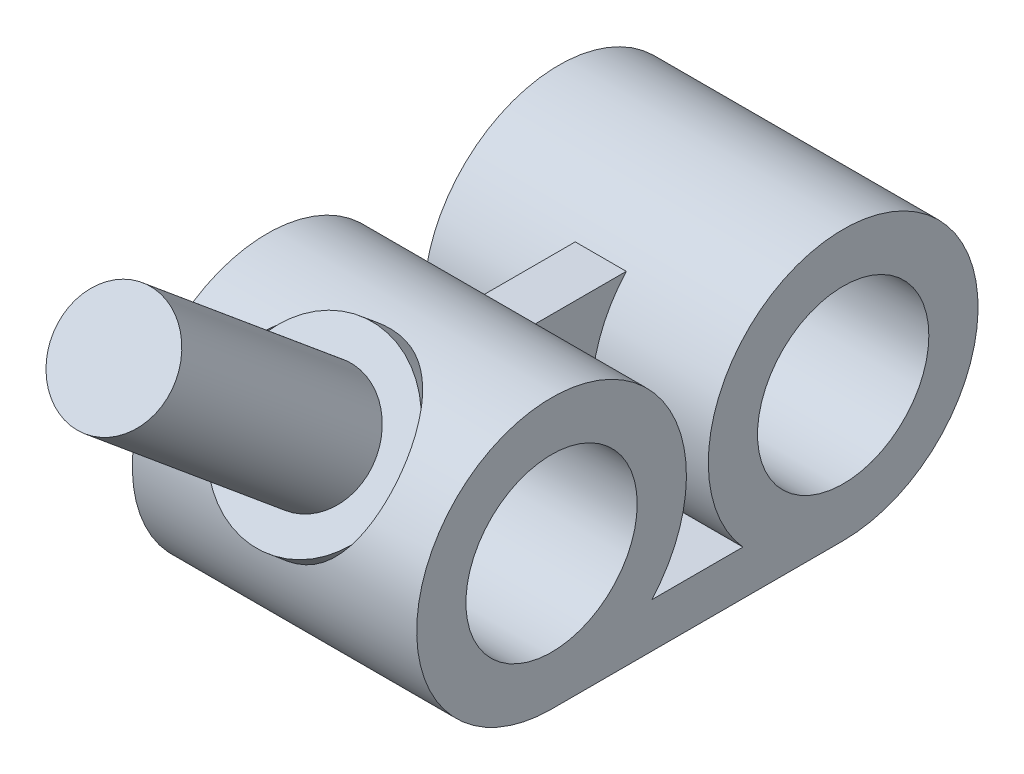
ISO-10303-21;
HEADER;
FILE_DESCRIPTION(('STEP AP214'),'2;1');
FILE_NAME('part.step','',(''),(''),'','','');
FILE_SCHEMA(('AUTOMOTIVE_DESIGN { 1 0 10303 214 1 1 1 1 }'));
ENDSEC;
DATA;
#1=APPLICATION_CONTEXT('core data for automotive mechanical design processes');
#2=APPLICATION_PROTOCOL_DEFINITION('international standard','automotive_design',2000,#1);
#3=PRODUCT_CONTEXT('',#1,'mechanical');
#4=PRODUCT('Part','Part','',(#3));
#5=PRODUCT_RELATED_PRODUCT_CATEGORY('part','',(#4));
#6=PRODUCT_DEFINITION_FORMATION('','',#4);
#7=PRODUCT_DEFINITION_CONTEXT('part definition',#1,'design');
#8=PRODUCT_DEFINITION('design','',#6,#7);
#9=PRODUCT_DEFINITION_SHAPE('','',#8);
#10=(LENGTH_UNIT() NAMED_UNIT(*) SI_UNIT(.MILLI.,.METRE.));
#11=(NAMED_UNIT(*) PLANE_ANGLE_UNIT() SI_UNIT($,.RADIAN.));
#12=(NAMED_UNIT(*) SI_UNIT($,.STERADIAN.) SOLID_ANGLE_UNIT());
#13=UNCERTAINTY_MEASURE_WITH_UNIT(LENGTH_MEASURE(1.E-05),#10,'distance_accuracy_value','');
#14=(GEOMETRIC_REPRESENTATION_CONTEXT(3) GLOBAL_UNCERTAINTY_ASSIGNED_CONTEXT((#13)) GLOBAL_UNIT_ASSIGNED_CONTEXT((#10,
#11,#12)) REPRESENTATION_CONTEXT('',''));
#15=CARTESIAN_POINT('',(0.,0.,0.));
#16=DIRECTION('',(0.,0.,1.));
#17=DIRECTION('',(1.,0.,0.));
#18=AXIS2_PLACEMENT_3D('',#15,#16,#17);
#19=CARTESIAN_POINT('',(3.9,6.7367906511766,8.10600096978896));
#20=DIRECTION('',(0.,-0.639164198403852,-0.769070300738991));
#21=DIRECTION('',(0.,0.769070300738991,-0.639164198403852));
#22=AXIS2_PLACEMENT_3D('',#19,#20,#21);
#23=CYLINDRICAL_SURFACE('',#22,2.475);
#24=CARTESIAN_POINT('',(3.9,3.66136733659236,0.533272795191256));
#25=CARTESIAN_POINT('',(3.96035169923798,3.66136684020359,0.533269791389044));
#26=CARTESIAN_POINT('',(4.02068909466153,3.66094173701192,0.536221693558098));
#27=CARTESIAN_POINT('',(4.14079766349037,3.65921193679614,0.547896744479978));
#28=CARTESIAN_POINT('',(4.20056865792641,3.65790697057511,0.556621659489321));
#29=CARTESIAN_POINT('',(4.37839333371762,3.65255795032774,0.591084684326416));
#30=CARTESIAN_POINT('',(4.49486852873705,3.64707958768171,0.625110413267217));
#31=CARTESIAN_POINT('',(4.71920355722017,3.63132863811482,0.710830204544946));
#32=CARTESIAN_POINT('',(4.82713633021219,3.62110332507454,0.762348730874311));
#33=CARTESIAN_POINT('',(5.03446891778196,3.59456556988517,0.879018074606407));
#34=CARTESIAN_POINT('',(5.13386719589653,3.57825203448935,0.944171339441164));
#35=CARTESIAN_POINT('',(5.338373200878,3.53503057336775,1.09575503706831));
#36=CARTESIAN_POINT('',(5.44192921817235,3.50686186472844,1.18391995855905));
#37=CARTESIAN_POINT('',(5.63582243337974,3.43854773563366,1.36975350354827));
#38=CARTESIAN_POINT('',(5.7261465231037,3.39839055683355,1.46743139374181));
#39=CARTESIAN_POINT('',(5.90417477709713,3.2972910923514,1.68344984058107));
#40=CARTESIAN_POINT('',(5.98957583055752,3.23417165637583,1.80272632927426));
#41=CARTESIAN_POINT('',(6.1004208715943,3.12457184002453,1.98293251063721));
#42=CARTESIAN_POINT('',(6.1344997717829,3.08553964918471,2.0432323927745));
#43=CARTESIAN_POINT('',(6.19643804062169,3.00241800663968,2.16351625627321));
#44=CARTESIAN_POINT('',(6.22430206096339,2.95833237498794,2.22350044086853));
#45=CARTESIAN_POINT('',(6.2705754025269,2.87040449540901,2.33565077062593));
#46=CARTESIAN_POINT('',(6.28969482229228,2.82709009859255,2.38793886803995));
#47=CARTESIAN_POINT('',(6.3223353750452,2.73673535609184,2.49097585801401));
#48=CARTESIAN_POINT('',(6.33585995916327,2.68969732869965,2.54172568148645));
#49=CARTESIAN_POINT('',(6.35706731715457,2.5922174279121,2.64106691695343));
#50=CARTESIAN_POINT('',(6.36475467336565,2.54177825842029,2.68965999376011));
#51=CARTESIAN_POINT('',(6.37416011715353,2.437930260991,2.78413810708275));
#52=CARTESIAN_POINT('',(6.37587905624015,2.38452185777674,2.8300235289796));
#53=CARTESIAN_POINT('',(6.3723946784436,2.23737554966483,2.94927977221814));
#54=CARTESIAN_POINT('',(6.36157986361421,2.14129834419299,3.01970474210796));
#55=CARTESIAN_POINT('',(6.32328866483668,1.94524492919007,3.14958425028785));
#56=CARTESIAN_POINT('',(6.29581106470832,1.84526843555692,3.20903798739849));
#57=CARTESIAN_POINT('',(6.22574011699369,1.64497923872544,3.31615426825691));
#58=CARTESIAN_POINT('',(6.18321287067475,1.54466987633284,3.36386685225359));
#59=CARTESIAN_POINT('',(6.08469000007099,1.34607709611851,3.44814786732903));
#60=CARTESIAN_POINT('',(6.02869194628293,1.24779404722435,3.484714285461));
#61=CARTESIAN_POINT('',(5.89663048726598,1.04292897624604,3.55181371992157));
#62=CARTESIAN_POINT('',(5.81889558606121,0.936959248478283,3.58091739766624));
#63=CARTESIAN_POINT('',(5.64990335458852,0.733515810748773,3.6280683668741));
#64=CARTESIAN_POINT('',(5.55862513343509,0.63605560254073,3.64609835207861));
#65=CARTESIAN_POINT('',(5.34855399116995,0.438416743885214,3.67549126174908));
#66=CARTESIAN_POINT('',(5.22769071697444,0.340201989737079,3.68536817185947));
#67=CARTESIAN_POINT('',(4.97094269146941,0.165275539321959,3.69734508513184));
#68=CARTESIAN_POINT('',(4.83508348084817,0.0885280452381102,3.69945810729078));
#69=CARTESIAN_POINT('',(4.59128093447964,-0.0180279134784635,3.70022379964095));
#70=CARTESIAN_POINT('',(4.48647582390875,-0.0549838747794087,3.69969371964533));
#71=CARTESIAN_POINT('',(4.27224426573367,-0.110990737454933,3.69844219099289));
#72=CARTESIAN_POINT('',(4.16282613685571,-0.130072540151083,3.69772107538347));
#73=CARTESIAN_POINT('',(3.94179610067674,-0.148386165937669,3.69703540939428));
#74=CARTESIAN_POINT('',(3.83017652553227,-0.147528086146994,3.69707428546149));
#75=CARTESIAN_POINT('',(3.60887646156706,-0.125837741322033,3.69787221162281));
#76=CARTESIAN_POINT('',(3.49919736044741,-0.104991727055434,3.69863175744502));
#77=CARTESIAN_POINT('',(3.29035376483972,-0.0470865010145389,3.69980319848386));
#78=CARTESIAN_POINT('',(3.19093831687886,-0.0109088206921487,3.70023085475316));
#79=CARTESIAN_POINT('',(2.9980613093856,0.0747869941949811,3.6994909080613));
#80=CARTESIAN_POINT('',(2.90460441065686,0.124315417234841,3.69832207195895));
#81=CARTESIAN_POINT('',(2.68242736270079,0.259827162489084,3.69174105198635));
#82=CARTESIAN_POINT('',(2.55754555011694,0.352047506849025,3.68460673214295));
#83=CARTESIAN_POINT('',(2.32346335686569,0.553603858278269,3.65976242348984));
#84=CARTESIAN_POINT('',(2.214291340759,0.662970097263978,3.64203359599904));
#85=CARTESIAN_POINT('',(2.01265755981257,0.894839473689987,3.59213483481954));
#86=CARTESIAN_POINT('',(1.92033120026324,1.01743744500216,3.55985455275018));
#87=CARTESIAN_POINT('',(1.75636732590912,1.27020199372295,3.47766409280892));
#88=CARTESIAN_POINT('',(1.6846882830782,1.40035273732642,3.42778975808418));
#89=CARTESIAN_POINT('',(1.57847891610148,1.63421382525544,3.32145739776305));
#90=CARTESIAN_POINT('',(1.53926011037175,1.73752052726545,3.26878833572464));
#91=CARTESIAN_POINT('',(1.47737828657382,1.94226334362736,3.15142609248525));
#92=CARTESIAN_POINT('',(1.4547042180974,2.04370066234117,3.08674097323169));
#93=CARTESIAN_POINT('',(1.42711025529208,2.24161426964071,2.94617197449559));
#94=CARTESIAN_POINT('',(1.42224655995015,2.33807390933849,2.87025343160072));
#95=CARTESIAN_POINT('',(1.43073097465891,2.52248884019421,2.70961147252231));
#96=CARTESIAN_POINT('',(1.44408044704879,2.61044349465495,2.62488739812572));
#97=CARTESIAN_POINT('',(1.48708693625634,2.77141307523469,2.45405103380299));
#98=CARTESIAN_POINT('',(1.51590295012298,2.84495238492219,2.36821564931763));
#99=CARTESIAN_POINT('',(1.58790375351059,2.98127921911922,2.19412891144384));
#100=CARTESIAN_POINT('',(1.63109108906794,3.04406483550719,2.10587713250901));
#101=CARTESIAN_POINT('',(1.73436120616424,3.16350747401506,1.92228428855463));
#102=CARTESIAN_POINT('',(1.79554428197063,3.21923093836584,1.82695929950726));
#103=CARTESIAN_POINT('',(1.93108487113476,3.31866069029091,1.63944166914076));
#104=CARTESIAN_POINT('',(2.00545298265339,3.36235723794035,1.54725161927362));
#105=CARTESIAN_POINT('',(2.17908265059583,3.44516416229748,1.35410402046793));
#106=CARTESIAN_POINT('',(2.28042654226146,3.48234657509862,1.2541887916594));
#107=CARTESIAN_POINT('',(2.49754989313856,3.54424164851188,1.06680679731168));
#108=CARTESIAN_POINT('',(2.61333484269171,3.56894954831031,0.979344793590898));
#109=CARTESIAN_POINT('',(2.83981814085063,3.6053708654268,0.834279564335827));
#110=CARTESIAN_POINT('',(2.94867850108483,3.61847673892284,0.774165929914656));
#111=CARTESIAN_POINT('',(3.17479572840557,3.63893420001597,0.67149963005829));
#112=CARTESIAN_POINT('',(3.2920298538377,3.64630077105362,0.62890137609596));
#113=CARTESIAN_POINT('',(3.49170169712941,3.65488408641233,0.57641481381412));
#114=CARTESIAN_POINT('',(3.57248064832151,3.65733858348706,0.560334810994783));
#115=CARTESIAN_POINT('',(3.73551536659048,3.66058044940817,0.538766466397052));
#116=CARTESIAN_POINT('',(3.81777096009196,3.66136801292081,0.533276887864288));
#117=CARTESIAN_POINT('',(3.9,3.66136733659236,0.533272795191256));
#118=B_SPLINE_CURVE_WITH_KNOTS('',3,(#24,#25,#26,#27,#28,#29,#30,#31,#32,#33,#34,#35,#36,#37,
#38,#39,#40,#41,#42,#43,#44,#45,#46,#47,#48,#49,#50,#51,#52,#53,#54,#55,#56,#57,#58,#59,#60,#61,
#62,#63,#64,#65,#66,#67,#68,#69,#70,#71,#72,#73,#74,#75,#76,#77,#78,#79,#80,#81,#82,#83,#84,#85,
#86,#87,#88,#89,#90,#91,#92,#93,#94,#95,#96,#97,#98,#99,#100,#101,#102,#103,#104,#105,#106,#107,
#108,#109,#110,#111,#112,#113,#114,#115,#116,#117),.UNSPECIFIED.,.T.,.F.,(4,2,2,2,2,2,2,2,2,2,2,
2,2,2,2,2,2,2,2,2,2,2,2,2,2,2,2,2,2,2,2,2,2,2,2,2,2,2,2,2,2,2,2,2,2,2,4),(0.,0.180952197601988,
0.361959783245286,0.724241031221584,1.08298934167057,1.44180210266734,1.85692066826374,
2.27244772914867,2.74857368162986,2.98676107618658,3.22476959031655,3.43606931192867,
3.64723849991097,3.85824174408705,4.0692148833432,4.42613967026706,4.78309051148555,
5.13849261924464,5.49395887303053,5.89625135628618,6.29917096359412,6.76518101533257,
7.23040927327125,7.56249423563766,7.89400401528303,8.22700876077034,8.56024273688472,
8.87647382373506,9.19294930773093,9.6567574676101,10.1213928147843,10.5896125117048,
11.0568837938154,11.4225625231499,11.7879967875957,12.1545831573178,12.521196949088,
12.8696411084721,13.218147031433,13.5954176720759,13.9729929500295,14.4125019393002,
14.8521785376569,15.2259657098504,15.5987737453451,15.845349460886,16.0918963794639),.UNSPECIFIED.);
#119=CARTESIAN_POINT('',(1.91814875622728,3.30693524450748,1.65956920198911));
#120=VERTEX_POINT('',#119);
#121=CARTESIAN_POINT('',(5.88185124377272,3.30693524450748,1.65956920198911));
#122=VERTEX_POINT('',#121);
#123=EDGE_CURVE('E130',#120,#122,#118,.T.);
#124=ORIENTED_EDGE('',*,*,#123,.F.);
#125=CARTESIAN_POINT('',(3.9,2.16676663258906,2.60714831950518));
#126=DIRECTION('',(0.,0.639164198403852,0.769070300738991));
#127=DIRECTION('',(0.,-0.769070300738991,0.639164198403852));
#128=AXIS2_PLACEMENT_3D('',#125,#126,#127);
#129=CIRCLE('',#128,2.475);
#130=EDGE_CURVE('E125',#122,#120,#129,.T.);
#131=ORIENTED_EDGE('',*,*,#130,.F.);
#132=EDGE_LOOP('',(#124,#131));
#133=FACE_BOUND('',#132,.T.);
#134=ADVANCED_FACE('F32',(#133),#23,.T.);
#135=CARTESIAN_POINT('',(5.88185124377272,1.02659802067064,3.55472743702125));
#136=VERTEX_POINT('',#135);
#137=CARTESIAN_POINT('',(1.91814875622728,1.02659802067064,3.55472743702125));
#138=VERTEX_POINT('',#137);
#139=EDGE_CURVE('E126',#136,#138,#118,.T.);
#140=ORIENTED_EDGE('',*,*,#139,.F.);
#141=EDGE_CURVE('E110',#138,#136,#129,.T.);
#142=ORIENTED_EDGE('',*,*,#141,.F.);
#143=EDGE_LOOP('',(#140,#142));
#144=FACE_BOUND('',#143,.T.);
#145=ADVANCED_FACE('F127',(#144),#23,.T.);
#146=CARTESIAN_POINT('',(4.6,0.,0.));
#147=DIRECTION('',(1.,0.,0.));
#148=DIRECTION('',(0.,0.,-1.));
#149=AXIS2_PLACEMENT_3D('',#146,#147,#148);
#150=PLANE('',#149);
#151=CARTESIAN_POINT('',(4.6,0.,-8.));
#152=DIRECTION('',(1.,0.,0.));
#153=DIRECTION('',(0.,0.,-1.));
#154=AXIS2_PLACEMENT_3D('',#151,#152,#153);
#155=CIRCLE('',#154,3.69999873615607);
#156=CARTESIAN_POINT('',(4.6,2.47537686980316,-5.25));
#157=VERTEX_POINT('',#156);
#158=CARTESIAN_POINT('',(4.6,-2.47537686980316,-5.25));
#159=VERTEX_POINT('',#158);
#160=EDGE_CURVE('E245',#157,#159,#155,.T.);
#161=ORIENTED_EDGE('',*,*,#160,.F.);
#162=DIRECTION('',(0.,0.,-1.));
#163=VECTOR('',#162,1.);
#164=CARTESIAN_POINT('',(4.6,2.47537686980316,0.));
#165=LINE('',#164,#163);
#166=CARTESIAN_POINT('',(4.6,2.47537686980316,-2.75));
#167=VERTEX_POINT('',#166);
#168=EDGE_CURVE('E275',#167,#157,#165,.T.);
#169=ORIENTED_EDGE('',*,*,#168,.F.);
#170=CARTESIAN_POINT('',(4.6,0.,0.));
#171=DIRECTION('',(1.,0.,0.));
#172=DIRECTION('',(0.,0.,-1.));
#173=AXIS2_PLACEMENT_3D('',#170,#171,#172);
#174=CIRCLE('',#173,3.69999873615607);
#175=CARTESIAN_POINT('',(4.6,-2.47537686980316,-2.75));
#176=VERTEX_POINT('',#175);
#177=EDGE_CURVE('E252',#176,#167,#174,.T.);
#178=ORIENTED_EDGE('',*,*,#177,.F.);
#179=DIRECTION('',(0.,0.,-1.));
#180=VECTOR('',#179,1.);
#181=CARTESIAN_POINT('',(4.6,-2.47537686980316,0.));
#182=LINE('',#181,#180);
#183=EDGE_CURVE('E240',#176,#159,#182,.T.);
#184=ORIENTED_EDGE('',*,*,#183,.T.);
#185=EDGE_LOOP('',(#161,#169,#178,#184));
#186=FACE_BOUND('',#185,.T.);
#187=ADVANCED_FACE('F178',(#186),#150,.T.);
#188=CARTESIAN_POINT('',(7.8,0.,0.));
#189=DIRECTION('',(1.,0.,0.));
#190=DIRECTION('',(0.,0.,-1.));
#191=AXIS2_PLACEMENT_3D('',#188,#189,#190);
#192=PLANE('',#191);
#193=CARTESIAN_POINT('',(7.8,0.,0.));
#194=DIRECTION('',(1.,0.,0.));
#195=DIRECTION('',(0.,0.,-1.));
#196=AXIS2_PLACEMENT_3D('',#193,#194,#195);
#197=CIRCLE('',#196,2.35);
#198=CARTESIAN_POINT('',(7.8,0.,-2.35));
#199=VERTEX_POINT('',#198);
#200=EDGE_CURVE('E221',#199,#199,#197,.T.);
#201=ORIENTED_EDGE('',*,*,#200,.F.);
#202=EDGE_LOOP('',(#201));
#203=FACE_BOUND('',#202,.T.);
#204=CARTESIAN_POINT('',(7.8,0.,-8.));
#205=DIRECTION('',(1.,0.,0.));
#206=DIRECTION('',(0.,0.,-1.));
#207=AXIS2_PLACEMENT_3D('',#204,#205,#206);
#208=CIRCLE('',#207,2.35);
#209=CARTESIAN_POINT('',(7.8,0.,-10.35));
#210=VERTEX_POINT('',#209);
#211=EDGE_CURVE('E228',#210,#210,#208,.T.);
#212=ORIENTED_EDGE('',*,*,#211,.F.);
#213=EDGE_LOOP('',(#212));
#214=FACE_BOUND('',#213,.T.);
#215=DIRECTION('',(0.,0.,-1.));
#216=VECTOR('',#215,1.);
#217=CARTESIAN_POINT('',(7.8,-3.69999873615607,0.));
#218=LINE('',#217,#216);
#219=CARTESIAN_POINT('',(7.8,-3.69999873615607,0.));
#220=VERTEX_POINT('',#219);
#221=CARTESIAN_POINT('',(7.8,-3.69999873615607,-8.));
#222=VERTEX_POINT('',#221);
#223=EDGE_CURVE('E41',#220,#222,#218,.T.);
#224=ORIENTED_EDGE('',*,*,#223,.T.);
#225=CARTESIAN_POINT('',(7.8,0.,-8.));
#226=DIRECTION('',(1.,0.,0.));
#227=DIRECTION('',(0.,0.,-1.));
#228=AXIS2_PLACEMENT_3D('',#225,#226,#227);
#229=CIRCLE('',#228,3.69999873615607);
#230=CARTESIAN_POINT('',(7.8,-2.47537686980316,-5.25));
#231=VERTEX_POINT('',#230);
#232=EDGE_CURVE('E246',#222,#231,#229,.T.);
#233=ORIENTED_EDGE('',*,*,#232,.T.);
#234=DIRECTION('',(0.,0.,-1.));
#235=VECTOR('',#234,1.);
#236=CARTESIAN_POINT('',(7.8,-2.47537686980316,0.));
#237=LINE('',#236,#235);
#238=CARTESIAN_POINT('',(7.8,-2.47537686980316,-2.75));
#239=VERTEX_POINT('',#238);
#240=EDGE_CURVE('E242',#239,#231,#237,.T.);
#241=ORIENTED_EDGE('',*,*,#240,.F.);
#242=CARTESIAN_POINT('',(7.8,0.,0.));
#243=DIRECTION('',(1.,0.,0.));
#244=DIRECTION('',(0.,0.,-1.));
#245=AXIS2_PLACEMENT_3D('',#242,#243,#244);
#246=CIRCLE('',#245,3.69999873615607);
#247=EDGE_CURVE('E217',#239,#220,#246,.T.);
#248=ORIENTED_EDGE('',*,*,#247,.T.);
#249=EDGE_LOOP('',(#224,#233,#241,#248));
#250=FACE_BOUND('',#249,.T.);
#251=ADVANCED_FACE('F181',(#203,#214,#250),#192,.T.);
#252=CARTESIAN_POINT('',(0.,0.,0.));
#253=DIRECTION('',(1.,0.,0.));
#254=DIRECTION('',(0.,0.,-1.));
#255=AXIS2_PLACEMENT_3D('',#252,#253,#254);
#256=PLANE('',#255);
#257=CARTESIAN_POINT('',(0.,0.,-8.));
#258=DIRECTION('',(1.,0.,0.));
#259=DIRECTION('',(0.,0.,-1.));
#260=AXIS2_PLACEMENT_3D('',#257,#258,#259);
#261=CIRCLE('',#260,2.35);
#262=CARTESIAN_POINT('',(0.,0.,-10.35));
#263=VERTEX_POINT('',#262);
#264=EDGE_CURVE('E231',#263,#263,#261,.T.);
#265=ORIENTED_EDGE('',*,*,#264,.T.);
#266=EDGE_LOOP('',(#265));
#267=FACE_BOUND('',#266,.T.);
#268=CARTESIAN_POINT('',(0.,0.,0.));
#269=DIRECTION('',(1.,0.,0.));
#270=DIRECTION('',(0.,0.,-1.));
#271=AXIS2_PLACEMENT_3D('',#268,#269,#270);
#272=CIRCLE('',#271,2.35);
#273=CARTESIAN_POINT('',(0.,0.,-2.35));
#274=VERTEX_POINT('',#273);
#275=EDGE_CURVE('E225',#274,#274,#272,.T.);
#276=ORIENTED_EDGE('',*,*,#275,.T.);
#277=EDGE_LOOP('',(#276));
#278=FACE_BOUND('',#277,.T.);
#279=CARTESIAN_POINT('',(0.,0.,-8.));
#280=DIRECTION('',(1.,0.,0.));
#281=DIRECTION('',(0.,0.,-1.));
#282=AXIS2_PLACEMENT_3D('',#279,#280,#281);
#283=CIRCLE('',#282,3.69999873615607);
#284=CARTESIAN_POINT('',(0.,-3.69999873615607,-8.));
#285=VERTEX_POINT('',#284);
#286=CARTESIAN_POINT('',(0.,-2.47537686980316,-5.25));
#287=VERTEX_POINT('',#286);
#288=EDGE_CURVE('E56',#285,#287,#283,.T.);
#289=ORIENTED_EDGE('',*,*,#288,.F.);
#290=DIRECTION('',(0.,0.,-1.));
#291=VECTOR('',#290,1.);
#292=CARTESIAN_POINT('',(0.,-3.69999873615607,0.));
#293=LINE('',#292,#291);
#294=CARTESIAN_POINT('',(0.,-3.69999873615607,0.));
#295=VERTEX_POINT('',#294);
#296=EDGE_CURVE('E211',#295,#285,#293,.T.);
#297=ORIENTED_EDGE('',*,*,#296,.F.);
#298=CARTESIAN_POINT('',(0.,0.,0.));
#299=DIRECTION('',(1.,0.,0.));
#300=DIRECTION('',(0.,0.,-1.));
#301=AXIS2_PLACEMENT_3D('',#298,#299,#300);
#302=CIRCLE('',#301,3.69999873615607);
#303=CARTESIAN_POINT('',(0.,-2.47537686980316,-2.75));
#304=VERTEX_POINT('',#303);
#305=EDGE_CURVE('E218',#304,#295,#302,.T.);
#306=ORIENTED_EDGE('',*,*,#305,.F.);
#307=DIRECTION('',(0.,0.,-1.));
#308=VECTOR('',#307,1.);
#309=CARTESIAN_POINT('',(0.,-2.47537686980316,0.));
#310=LINE('',#309,#308);
#311=EDGE_CURVE('E261',#304,#287,#310,.T.);
#312=ORIENTED_EDGE('',*,*,#311,.T.);
#313=EDGE_LOOP('',(#289,#297,#306,#312));
#314=FACE_BOUND('',#313,.T.);
#315=ADVANCED_FACE('F199',(#267,#278,#314),#256,.F.);
#316=CARTESIAN_POINT('',(7.8,-3.69999873615607,0.));
#317=DIRECTION('',(0.,1.,0.));
#318=DIRECTION('',(0.,0.,1.));
#319=AXIS2_PLACEMENT_3D('',#316,#317,#318);
#320=PLANE('',#319);
#321=ORIENTED_EDGE('',*,*,#296,.T.);
#322=DIRECTION('',(1.,0.,0.));
#323=VECTOR('',#322,1.);
#324=CARTESIAN_POINT('',(-2.2,-3.69999873615607,-8.));
#325=LINE('',#324,#323);
#326=EDGE_CURVE('E212',#285,#222,#325,.T.);
#327=ORIENTED_EDGE('',*,*,#326,.T.);
#328=ORIENTED_EDGE('',*,*,#223,.F.);
#329=DIRECTION('',(-1.,0.,0.));
#330=VECTOR('',#329,1.);
#331=CARTESIAN_POINT('',(7.8,-3.69999873615607,0.));
#332=LINE('',#331,#330);
#333=EDGE_CURVE('E11',#220,#295,#332,.T.);
#334=ORIENTED_EDGE('',*,*,#333,.T.);
#335=EDGE_LOOP('',(#321,#327,#328,#334));
#336=FACE_BOUND('',#335,.T.);
#337=ADVANCED_FACE('F202',(#336),#320,.F.);
#338=CARTESIAN_POINT('',(7.8,0.,0.));
#339=DIRECTION('',(-1.,0.,0.));
#340=DIRECTION('',(0.,0.,1.));
#341=AXIS2_PLACEMENT_3D('',#338,#339,#340);
#342=CYLINDRICAL_SURFACE('',#341,3.69999873615607);
#343=EDGE_CURVE('E123',#122,#136,#118,.T.);
#344=ORIENTED_EDGE('',*,*,#343,.T.);
#345=ORIENTED_EDGE('',*,*,#139,.T.);
#346=CARTESIAN_POINT('',(1.91814875622727,1.02659802067064,3.55472743702125));
#347=CARTESIAN_POINT('',(1.8810838999463,1.07856374858281,3.53971986908742));
#348=CARTESIAN_POINT('',(1.84575081430926,1.13132062217274,3.52324770723237));
#349=CARTESIAN_POINT('',(1.7787545458356,1.23812765477778,3.48715010337745));
#350=CARTESIAN_POINT('',(1.74709413869151,1.29217875518693,3.46752230283382));
#351=CARTESIAN_POINT('',(1.6577594925105,1.45618323138674,3.40342462657411));
#352=CARTESIAN_POINT('',(1.60605118140623,1.56754023953626,3.35386439211059));
#353=CARTESIAN_POINT('',(1.5207449879853,1.79062422526071,3.24027651635954));
#354=CARTESIAN_POINT('',(1.48723461908773,1.90235043574906,3.17618103067336));
#355=CARTESIAN_POINT('',(1.4407756784184,2.12105952967239,3.03446589589767));
#356=CARTESIAN_POINT('',(1.4277658116856,2.22805561977965,2.95688733547346));
#357=CARTESIAN_POINT('',(1.42324648831758,2.42378116153536,2.79815576259605));
#358=CARTESIAN_POINT('',(1.42985433266167,2.51328436566424,2.71800208251669));
#359=CARTESIAN_POINT('',(1.46018891954748,2.68269297567103,2.55094297925091));
#360=CARTESIAN_POINT('',(1.48393148119447,2.76258943283826,2.46403138322941));
#361=CARTESIAN_POINT('',(1.5466717969824,2.90973939534616,2.28829984223249));
#362=CARTESIAN_POINT('',(1.58536904900071,2.97720551074494,2.19954820389246));
#363=CARTESIAN_POINT('',(1.67642601700788,3.10093902984668,2.0213665715949));
#364=CARTESIAN_POINT('',(1.72877733297628,3.15721328143144,1.93193702741601));
#365=CARTESIAN_POINT('',(1.80753709387398,3.2258453974091,1.81251097392677));
#366=CARTESIAN_POINT('',(1.82869983367331,3.24297988679024,1.78165367144299));
#367=CARTESIAN_POINT('',(1.87239888674209,3.27592562348024,1.72032199358285));
#368=CARTESIAN_POINT('',(1.89493222671345,3.29173957015484,1.68984695092594));
#369=CARTESIAN_POINT('',(1.91814875622713,3.30693524450754,1.65956920198905));
#370=B_SPLINE_CURVE_WITH_KNOTS('',3,(#346,#347,#348,#349,#350,#351,#352,#353,#354,#355,#356,
#357,#358,#359,#360,#361,#362,#363,#364,#365,#366,#367,#368,#369),.UNSPECIFIED.,.F.,.F.,(4,2,2,
2,2,2,2,2,2,2,2,4),(0.,0.196624646791892,0.393396941139939,0.788613864870799,1.18571491451533,
1.58162639361133,1.94080766218015,2.30032095880092,2.65295717673829,3.00537696146125,
3.12880641865337,3.25197705665516),.UNSPECIFIED.);
#371=EDGE_CURVE('E124',#138,#120,#370,.T.);
#372=ORIENTED_EDGE('',*,*,#371,.T.);
#373=ORIENTED_EDGE('',*,*,#123,.T.);
#374=EDGE_LOOP('',(#344,#345,#372,#373));
#375=FACE_BOUND('',#374,.T.);
#376=DIRECTION('',(-1.,0.,0.));
#377=VECTOR('',#376,1.);
#378=CARTESIAN_POINT('',(3.2,-2.47537686980316,-2.75));
#379=LINE('',#378,#377);
#380=CARTESIAN_POINT('',(3.2,-2.47537686980316,-2.75));
#381=VERTEX_POINT('',#380);
#382=EDGE_CURVE('E249',#381,#304,#379,.T.);
#383=ORIENTED_EDGE('',*,*,#382,.T.);
#384=ORIENTED_EDGE('',*,*,#305,.T.);
#385=ORIENTED_EDGE('',*,*,#333,.F.);
#386=ORIENTED_EDGE('',*,*,#247,.F.);
#387=DIRECTION('',(1.,0.,0.));
#388=VECTOR('',#387,1.);
#389=CARTESIAN_POINT('',(4.6,-2.47537686980316,-2.75));
#390=LINE('',#389,#388);
#391=EDGE_CURVE('E237',#176,#239,#390,.T.);
#392=ORIENTED_EDGE('',*,*,#391,.F.);
#393=ORIENTED_EDGE('',*,*,#177,.T.);
#394=DIRECTION('',(-1.,0.,0.));
#395=VECTOR('',#394,1.);
#396=CARTESIAN_POINT('',(12.6931884146824,2.47537686980316,-2.75));
#397=LINE('',#396,#395);
#398=CARTESIAN_POINT('',(3.2,2.47537686980316,-2.75));
#399=VERTEX_POINT('',#398);
#400=EDGE_CURVE('E136',#167,#399,#397,.T.);
#401=ORIENTED_EDGE('',*,*,#400,.T.);
#402=CARTESIAN_POINT('',(3.2,0.,0.));
#403=DIRECTION('',(1.,0.,0.));
#404=DIRECTION('',(0.,0.,-1.));
#405=AXIS2_PLACEMENT_3D('',#402,#403,#404);
#406=CIRCLE('',#405,3.69999873615607);
#407=EDGE_CURVE('E268',#381,#399,#406,.T.);
#408=ORIENTED_EDGE('',*,*,#407,.F.);
#409=EDGE_LOOP('',(#383,#384,#385,#386,#392,#393,#401,#408));
#410=FACE_BOUND('',#409,.T.);
#411=ADVANCED_FACE('F34',(#375,#410),#342,.T.);
#412=CARTESIAN_POINT('',(7.8,0.,0.));
#413=DIRECTION('',(-1.,0.,0.));
#414=DIRECTION('',(0.,0.,1.));
#415=AXIS2_PLACEMENT_3D('',#412,#413,#414);
#416=CYLINDRICAL_SURFACE('',#415,2.35);
#417=ORIENTED_EDGE('',*,*,#200,.T.);
#418=EDGE_LOOP('',(#417));
#419=FACE_BOUND('',#418,.T.);
#420=ORIENTED_EDGE('',*,*,#275,.F.);
#421=EDGE_LOOP('',(#420));
#422=FACE_BOUND('',#421,.T.);
#423=ADVANCED_FACE('F192',(#419,#422),#416,.F.);
#424=CARTESIAN_POINT('',(7.8,0.,-8.));
#425=DIRECTION('',(-1.,0.,0.));
#426=DIRECTION('',(0.,0.,1.));
#427=AXIS2_PLACEMENT_3D('',#424,#425,#426);
#428=CYLINDRICAL_SURFACE('',#427,2.35);
#429=ORIENTED_EDGE('',*,*,#211,.T.);
#430=EDGE_LOOP('',(#429));
#431=FACE_BOUND('',#430,.T.);
#432=ORIENTED_EDGE('',*,*,#264,.F.);
#433=EDGE_LOOP('',(#432));
#434=FACE_BOUND('',#433,.T.);
#435=ADVANCED_FACE('F189',(#431,#434),#428,.F.);
#436=CARTESIAN_POINT('',(4.6,0.,-8.));
#437=DIRECTION('',(1.,0.,0.));
#438=DIRECTION('',(0.,0.,-1.));
#439=AXIS2_PLACEMENT_3D('',#436,#437,#438);
#440=CYLINDRICAL_SURFACE('',#439,3.69999873615607);
#441=ORIENTED_EDGE('',*,*,#232,.F.);
#442=ORIENTED_EDGE('',*,*,#326,.F.);
#443=ORIENTED_EDGE('',*,*,#288,.T.);
#444=DIRECTION('',(-1.,0.,0.));
#445=VECTOR('',#444,1.);
#446=CARTESIAN_POINT('',(3.2,-2.47537686980316,-5.25));
#447=LINE('',#446,#445);
#448=CARTESIAN_POINT('',(3.2,-2.47537686980316,-5.25));
#449=VERTEX_POINT('',#448);
#450=EDGE_CURVE('E256',#449,#287,#447,.T.);
#451=ORIENTED_EDGE('',*,*,#450,.F.);
#452=CARTESIAN_POINT('',(3.2,0.,-8.));
#453=DIRECTION('',(1.,0.,0.));
#454=DIRECTION('',(0.,0.,-1.));
#455=AXIS2_PLACEMENT_3D('',#452,#453,#454);
#456=CIRCLE('',#455,3.69999873615607);
#457=CARTESIAN_POINT('',(3.2,2.47537686980316,-5.25));
#458=VERTEX_POINT('',#457);
#459=EDGE_CURVE('E264',#458,#449,#456,.T.);
#460=ORIENTED_EDGE('',*,*,#459,.F.);
#461=DIRECTION('',(-1.,0.,0.));
#462=VECTOR('',#461,1.);
#463=CARTESIAN_POINT('',(12.6931884146824,2.47537686980316,-5.25));
#464=LINE('',#463,#462);
#465=EDGE_CURVE('E135',#157,#458,#464,.T.);
#466=ORIENTED_EDGE('',*,*,#465,.F.);
#467=ORIENTED_EDGE('',*,*,#160,.T.);
#468=DIRECTION('',(1.,0.,0.));
#469=VECTOR('',#468,1.);
#470=CARTESIAN_POINT('',(4.6,-2.47537686980316,-5.25));
#471=LINE('',#470,#469);
#472=EDGE_CURVE('E234',#159,#231,#471,.T.);
#473=ORIENTED_EDGE('',*,*,#472,.T.);
#474=EDGE_LOOP('',(#441,#442,#443,#451,#460,#466,#467,#473));
#475=FACE_BOUND('',#474,.T.);
#476=ADVANCED_FACE('F185',(#475),#440,.T.);
#477=CARTESIAN_POINT('',(4.6,-2.47537686980316,0.));
#478=DIRECTION('',(0.,-1.,0.));
#479=DIRECTION('',(0.,0.,-1.));
#480=AXIS2_PLACEMENT_3D('',#477,#478,#479);
#481=PLANE('',#480);
#482=ORIENTED_EDGE('',*,*,#240,.T.);
#483=ORIENTED_EDGE('',*,*,#472,.F.);
#484=ORIENTED_EDGE('',*,*,#183,.F.);
#485=ORIENTED_EDGE('',*,*,#391,.T.);
#486=EDGE_LOOP('',(#482,#483,#484,#485));
#487=FACE_BOUND('',#486,.T.);
#488=ADVANCED_FACE('F176',(#487),#481,.F.);
#489=CARTESIAN_POINT('',(3.2,-2.47537686980316,0.));
#490=DIRECTION('',(0.,1.,0.));
#491=DIRECTION('',(0.,0.,1.));
#492=AXIS2_PLACEMENT_3D('',#489,#490,#491);
#493=PLANE('',#492);
#494=ORIENTED_EDGE('',*,*,#311,.F.);
#495=ORIENTED_EDGE('',*,*,#382,.F.);
#496=DIRECTION('',(0.,0.,-1.));
#497=VECTOR('',#496,1.);
#498=CARTESIAN_POINT('',(3.2,-2.47537686980316,0.));
#499=LINE('',#498,#497);
#500=EDGE_CURVE('E271',#381,#449,#499,.T.);
#501=ORIENTED_EDGE('',*,*,#500,.T.);
#502=ORIENTED_EDGE('',*,*,#450,.T.);
#503=EDGE_LOOP('',(#494,#495,#501,#502));
#504=FACE_BOUND('',#503,.T.);
#505=ADVANCED_FACE('F172',(#504),#493,.T.);
#506=CARTESIAN_POINT('',(3.2,0.,0.));
#507=DIRECTION('',(-1.,0.,0.));
#508=DIRECTION('',(0.,0.,-1.));
#509=AXIS2_PLACEMENT_3D('',#506,#507,#508);
#510=PLANE('',#509);
#511=ORIENTED_EDGE('',*,*,#459,.T.);
#512=ORIENTED_EDGE('',*,*,#500,.F.);
#513=ORIENTED_EDGE('',*,*,#407,.T.);
#514=DIRECTION('',(0.,0.,-1.));
#515=VECTOR('',#514,1.);
#516=CARTESIAN_POINT('',(3.2,2.47537686980316,0.));
#517=LINE('',#516,#515);
#518=EDGE_CURVE('E258',#399,#458,#517,.T.);
#519=ORIENTED_EDGE('',*,*,#518,.T.);
#520=EDGE_LOOP('',(#511,#512,#513,#519));
#521=FACE_BOUND('',#520,.T.);
#522=ADVANCED_FACE('F168',(#521),#510,.T.);
#523=CARTESIAN_POINT('',(12.6931884146824,2.47537686980316,0.));
#524=DIRECTION('',(0.,1.,0.));
#525=DIRECTION('',(0.,0.,1.));
#526=AXIS2_PLACEMENT_3D('',#523,#524,#525);
#527=PLANE('',#526);
#528=ORIENTED_EDGE('',*,*,#400,.F.);
#529=ORIENTED_EDGE('',*,*,#168,.T.);
#530=ORIENTED_EDGE('',*,*,#465,.T.);
#531=ORIENTED_EDGE('',*,*,#518,.F.);
#532=EDGE_LOOP('',(#528,#529,#530,#531));
#533=FACE_BOUND('',#532,.T.);
#534=ADVANCED_FACE('F155',(#533),#527,.T.);
#535=CARTESIAN_POINT('',(3.9,2.16676663258906,2.60714831950518));
#536=DIRECTION('',(0.,0.639164198403852,0.769070300738991));
#537=DIRECTION('',(0.,-0.769070300738991,0.639164198403852));
#538=AXIS2_PLACEMENT_3D('',#535,#536,#537);
#539=CYLINDRICAL_SURFACE('',#538,2.475);
#540=EDGE_CURVE('E48',#120,#138,#129,.T.);
#541=ORIENTED_EDGE('',*,*,#540,.F.);
#542=ORIENTED_EDGE('',*,*,#371,.F.);
#543=EDGE_LOOP('',(#541,#542));
#544=FACE_BOUND('',#543,.T.);
#545=ADVANCED_FACE('F150',(#544),#539,.F.);
#546=EDGE_CURVE('E113',#136,#122,#129,.T.);
#547=ORIENTED_EDGE('',*,*,#546,.F.);
#548=ORIENTED_EDGE('',*,*,#343,.F.);
#549=EDGE_LOOP('',(#547,#548));
#550=FACE_BOUND('',#549,.T.);
#551=ADVANCED_FACE('F121',(#550),#539,.F.);
#552=CARTESIAN_POINT('',(3.9,2.16676663258906,2.60714831950518));
#553=DIRECTION('',(0.,0.639164198403852,0.769070300738991));
#554=DIRECTION('',(0.,-0.769070300738991,0.639164198403852));
#555=AXIS2_PLACEMENT_3D('',#552,#553,#554);
#556=PLANE('',#555);
#557=CARTESIAN_POINT('',(3.9,2.16676663258906,2.60714831950518));
#558=DIRECTION('',(0.,0.639164198403852,0.769070300738991));
#559=DIRECTION('',(0.,-0.769070300738991,0.639164198403852));
#560=AXIS2_PLACEMENT_3D('',#557,#558,#559);
#561=CIRCLE('',#560,1.57);
#562=CARTESIAN_POINT('',(3.9,0.959326260428841,3.61063611099923));
#563=VERTEX_POINT('',#562);
#564=EDGE_CURVE('E118',#563,#563,#561,.T.);
#565=ORIENTED_EDGE('',*,*,#564,.F.);
#566=EDGE_LOOP('',(#565));
#567=FACE_BOUND('',#566,.T.);
#568=ORIENTED_EDGE('',*,*,#546,.T.);
#569=ORIENTED_EDGE('',*,*,#130,.T.);
#570=ORIENTED_EDGE('',*,*,#540,.T.);
#571=ORIENTED_EDGE('',*,*,#141,.T.);
#572=EDGE_LOOP('',(#568,#569,#570,#571));
#573=FACE_BOUND('',#572,.T.);
#574=ADVANCED_FACE('F112',(#567,#573),#556,.T.);
#575=CARTESIAN_POINT('',(3.9,2.16676663258906,2.60714831950518));
#576=DIRECTION('',(0.,0.639164198403852,0.769070300738991));
#577=DIRECTION('',(0.,-0.769070300738991,0.639164198403852));
#578=AXIS2_PLACEMENT_3D('',#575,#576,#577);
#579=CYLINDRICAL_SURFACE('',#578,1.57);
#580=ORIENTED_EDGE('',*,*,#564,.T.);
#581=EDGE_LOOP('',(#580));
#582=FACE_BOUND('',#581,.T.);
#583=CARTESIAN_POINT('',(3.9,6.7367906511766,8.10600096978896));
#584=DIRECTION('',(0.,0.639164198403852,0.769070300738991));
#585=DIRECTION('',(0.,-0.769070300738991,0.639164198403852));
#586=AXIS2_PLACEMENT_3D('',#583,#584,#585);
#587=CIRCLE('',#586,1.57);
#588=CARTESIAN_POINT('',(3.9,5.52935027901638,9.10948876128301));
#589=VERTEX_POINT('',#588);
#590=EDGE_CURVE('E466',#589,#589,#587,.T.);
#591=ORIENTED_EDGE('',*,*,#590,.F.);
#592=EDGE_LOOP('',(#591));
#593=FACE_BOUND('',#592,.T.);
#594=ADVANCED_FACE('F160',(#582,#593),#579,.T.);
#595=CARTESIAN_POINT('',(3.9,6.7367906511766,8.10600096978896));
#596=DIRECTION('',(0.,-0.639164198403852,-0.769070300738991));
#597=DIRECTION('',(0.,0.769070300738991,-0.639164198403852));
#598=AXIS2_PLACEMENT_3D('',#595,#596,#597);
#599=PLANE('',#598);
#600=ORIENTED_EDGE('',*,*,#590,.T.);
#601=EDGE_LOOP('',(#600));
#602=FACE_BOUND('',#601,.T.);
#603=ADVANCED_FACE('F158',(#602),#599,.F.);
#604=CLOSED_SHELL('',(#134,#145,#187,#251,#315,#337,#411,#423,#435,#476,#488,#505,#522,#534,
#545,#551,#574,#594,#603));
#605=MANIFOLD_SOLID_BREP('B2',#604);
#606=ADVANCED_BREP_SHAPE_REPRESENTATION('',(#18,#605),#14);
#607=SHAPE_DEFINITION_REPRESENTATION(#9,#606);
ENDSEC;
END-ISO-10303-21;
